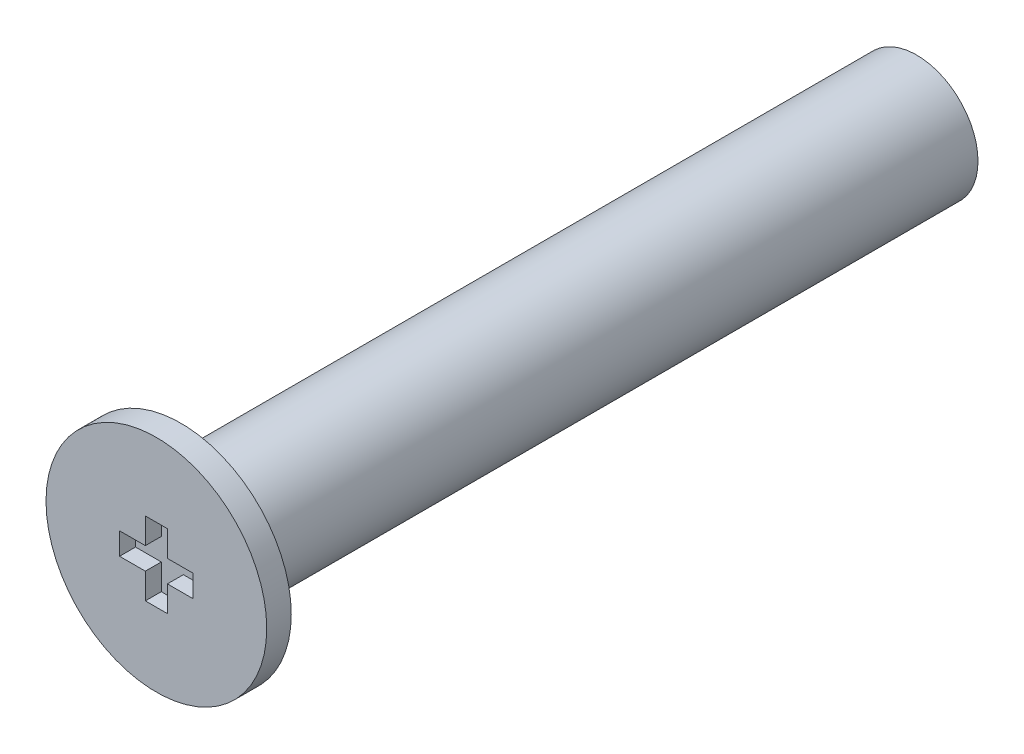
ISO-10303-21;
HEADER;
FILE_DESCRIPTION(('STEP AP214'),'2;1');
FILE_NAME('part.step','',(''),(''),'','','');
FILE_SCHEMA(('AUTOMOTIVE_DESIGN { 1 0 10303 214 1 1 1 1 }'));
ENDSEC;
DATA;
#1=APPLICATION_CONTEXT('core data for automotive mechanical design processes');
#2=APPLICATION_PROTOCOL_DEFINITION('international standard','automotive_design',2000,#1);
#3=PRODUCT_CONTEXT('',#1,'mechanical');
#4=PRODUCT('Part','Part','',(#3));
#5=PRODUCT_RELATED_PRODUCT_CATEGORY('part','',(#4));
#6=PRODUCT_DEFINITION_FORMATION('','',#4);
#7=PRODUCT_DEFINITION_CONTEXT('part definition',#1,'design');
#8=PRODUCT_DEFINITION('design','',#6,#7);
#9=PRODUCT_DEFINITION_SHAPE('','',#8);
#10=(LENGTH_UNIT() NAMED_UNIT(*) SI_UNIT(.MILLI.,.METRE.));
#11=(NAMED_UNIT(*) PLANE_ANGLE_UNIT() SI_UNIT($,.RADIAN.));
#12=(NAMED_UNIT(*) SI_UNIT($,.STERADIAN.) SOLID_ANGLE_UNIT());
#13=UNCERTAINTY_MEASURE_WITH_UNIT(LENGTH_MEASURE(1.E-05),#10,'distance_accuracy_value','');
#14=(GEOMETRIC_REPRESENTATION_CONTEXT(3) GLOBAL_UNCERTAINTY_ASSIGNED_CONTEXT((#13)) GLOBAL_UNIT_ASSIGNED_CONTEXT((#10,
#11,#12)) REPRESENTATION_CONTEXT('',''));
#15=CARTESIAN_POINT('',(0.,0.,0.));
#16=DIRECTION('',(0.,0.,1.));
#17=DIRECTION('',(1.,0.,0.));
#18=AXIS2_PLACEMENT_3D('',#15,#16,#17);
#19=CARTESIAN_POINT('',(0.,0.,-30.));
#20=DIRECTION('',(0.,0.,1.));
#21=DIRECTION('',(1.,0.,0.));
#22=AXIS2_PLACEMENT_3D('',#19,#20,#21);
#23=CYLINDRICAL_SURFACE('',#22,2.5);
#24=CARTESIAN_POINT('',(0.,0.,-30.));
#25=DIRECTION('',(0.,0.,1.));
#26=DIRECTION('',(1.,0.,0.));
#27=AXIS2_PLACEMENT_3D('',#24,#25,#26);
#28=CIRCLE('',#27,2.5);
#29=CARTESIAN_POINT('',(2.5,0.,-30.));
#30=VERTEX_POINT('',#29);
#31=EDGE_CURVE('E212',#30,#30,#28,.T.);
#32=ORIENTED_EDGE('',*,*,#31,.T.);
#33=EDGE_LOOP('',(#32));
#34=FACE_BOUND('',#33,.T.);
#35=CARTESIAN_POINT('',(0.,0.,0.));
#36=DIRECTION('',(0.,0.,1.));
#37=DIRECTION('',(1.,0.,0.));
#38=AXIS2_PLACEMENT_3D('',#35,#36,#37);
#39=CIRCLE('',#38,2.5);
#40=CARTESIAN_POINT('',(2.5,0.,0.));
#41=VERTEX_POINT('',#40);
#42=EDGE_CURVE('E208',#41,#41,#39,.T.);
#43=ORIENTED_EDGE('',*,*,#42,.F.);
#44=EDGE_LOOP('',(#43));
#45=FACE_BOUND('',#44,.T.);
#46=ADVANCED_FACE('F41',(#34,#45),#23,.T.);
#47=CARTESIAN_POINT('',(0.,0.,-30.));
#48=DIRECTION('',(0.,0.,1.));
#49=DIRECTION('',(1.,0.,0.));
#50=AXIS2_PLACEMENT_3D('',#47,#48,#49);
#51=PLANE('',#50);
#52=ORIENTED_EDGE('',*,*,#31,.F.);
#53=EDGE_LOOP('',(#52));
#54=FACE_BOUND('',#53,.T.);
#55=ADVANCED_FACE('F281',(#54),#51,.F.);
#56=CARTESIAN_POINT('',(0.,0.,0.));
#57=DIRECTION('',(0.,0.,1.));
#58=DIRECTION('',(1.,0.,0.));
#59=AXIS2_PLACEMENT_3D('',#56,#57,#58);
#60=PLANE('',#59);
#61=ORIENTED_EDGE('',*,*,#42,.T.);
#62=EDGE_LOOP('',(#61));
#63=FACE_BOUND('',#62,.T.);
#64=CARTESIAN_POINT('',(0.,0.,0.));
#65=DIRECTION('',(0.,0.,-1.));
#66=DIRECTION('',(-1.,0.,0.));
#67=AXIS2_PLACEMENT_3D('',#64,#65,#66);
#68=CIRCLE('',#67,4.5);
#69=CARTESIAN_POINT('',(-4.5,0.,0.));
#70=VERTEX_POINT('',#69);
#71=EDGE_CURVE('E210',#70,#70,#68,.T.);
#72=ORIENTED_EDGE('',*,*,#71,.T.);
#73=EDGE_LOOP('',(#72));
#74=FACE_BOUND('',#73,.T.);
#75=ADVANCED_FACE('F286',(#63,#74),#60,.F.);
#76=CARTESIAN_POINT('',(0.,0.,-2.));
#77=DIRECTION('',(0.,0.,-1.));
#78=DIRECTION('',(-1.,0.,0.));
#79=AXIS2_PLACEMENT_3D('',#76,#77,#78);
#80=CYLINDRICAL_SURFACE('',#79,4.5);
#81=ORIENTED_EDGE('',*,*,#71,.F.);
#82=EDGE_LOOP('',(#81));
#83=FACE_BOUND('',#82,.T.);
#84=CARTESIAN_POINT('',(0.,0.,1.));
#85=DIRECTION('',(0.,0.,-1.));
#86=DIRECTION('',(-1.,0.,0.));
#87=AXIS2_PLACEMENT_3D('',#84,#85,#86);
#88=CIRCLE('',#87,4.5);
#89=CARTESIAN_POINT('',(-4.5,0.,1.));
#90=VERTEX_POINT('',#89);
#91=EDGE_CURVE('E179',#90,#90,#88,.T.);
#92=ORIENTED_EDGE('',*,*,#91,.T.);
#93=EDGE_LOOP('',(#92));
#94=FACE_BOUND('',#93,.T.);
#95=ADVANCED_FACE('F300',(#83,#94),#80,.T.);
#96=CARTESIAN_POINT('',(4.5,0.,1.));
#97=DIRECTION('',(0.,0.,-1.));
#98=DIRECTION('',(-1.,0.,0.));
#99=AXIS2_PLACEMENT_3D('',#96,#97,#98);
#100=PLANE('',#99);
#101=DIRECTION('',(-1.,0.,0.));
#102=VECTOR('',#101,1.);
#103=CARTESIAN_POINT('',(4.5,-1.5,1.));
#104=LINE('',#103,#102);
#105=CARTESIAN_POINT('',(0.45,-1.5,1.));
#106=VERTEX_POINT('',#105);
#107=CARTESIAN_POINT('',(-0.45,-1.5,1.));
#108=VERTEX_POINT('',#107);
#109=EDGE_CURVE('E211',#106,#108,#104,.T.);
#110=ORIENTED_EDGE('',*,*,#109,.T.);
#111=DIRECTION('',(0.,1.,0.));
#112=VECTOR('',#111,1.);
#113=CARTESIAN_POINT('',(-0.45,0.,1.));
#114=LINE('',#113,#112);
#115=CARTESIAN_POINT('',(-0.45,-0.45,1.));
#116=VERTEX_POINT('',#115);
#117=EDGE_CURVE('E11',#108,#116,#114,.T.);
#118=ORIENTED_EDGE('',*,*,#117,.T.);
#119=DIRECTION('',(-1.,0.,0.));
#120=VECTOR('',#119,1.);
#121=CARTESIAN_POINT('',(4.5,-0.45,1.));
#122=LINE('',#121,#120);
#123=CARTESIAN_POINT('',(-1.5,-0.45,1.));
#124=VERTEX_POINT('',#123);
#125=EDGE_CURVE('E48',#116,#124,#122,.T.);
#126=ORIENTED_EDGE('',*,*,#125,.T.);
#127=DIRECTION('',(0.,1.,0.));
#128=VECTOR('',#127,1.);
#129=CARTESIAN_POINT('',(-1.5,0.,1.));
#130=LINE('',#129,#128);
#131=CARTESIAN_POINT('',(-1.5,0.45,1.));
#132=VERTEX_POINT('',#131);
#133=EDGE_CURVE('E241',#124,#132,#130,.T.);
#134=ORIENTED_EDGE('',*,*,#133,.T.);
#135=DIRECTION('',(1.,0.,0.));
#136=VECTOR('',#135,1.);
#137=CARTESIAN_POINT('',(4.5,0.45,1.));
#138=LINE('',#137,#136);
#139=CARTESIAN_POINT('',(-0.45,0.45,1.));
#140=VERTEX_POINT('',#139);
#141=EDGE_CURVE('E236',#132,#140,#138,.T.);
#142=ORIENTED_EDGE('',*,*,#141,.T.);
#143=DIRECTION('',(0.,1.,0.));
#144=VECTOR('',#143,1.);
#145=CARTESIAN_POINT('',(-0.45,0.,1.));
#146=LINE('',#145,#144);
#147=CARTESIAN_POINT('',(-0.45,1.5,1.));
#148=VERTEX_POINT('',#147);
#149=EDGE_CURVE('E237',#140,#148,#146,.T.);
#150=ORIENTED_EDGE('',*,*,#149,.T.);
#151=DIRECTION('',(1.,0.,0.));
#152=VECTOR('',#151,1.);
#153=CARTESIAN_POINT('',(4.5,1.5,1.));
#154=LINE('',#153,#152);
#155=CARTESIAN_POINT('',(0.45,1.5,1.));
#156=VERTEX_POINT('',#155);
#157=EDGE_CURVE('E231',#148,#156,#154,.T.);
#158=ORIENTED_EDGE('',*,*,#157,.T.);
#159=DIRECTION('',(0.,-1.,0.));
#160=VECTOR('',#159,1.);
#161=CARTESIAN_POINT('',(0.45,0.,1.));
#162=LINE('',#161,#160);
#163=CARTESIAN_POINT('',(0.45,0.45,1.));
#164=VERTEX_POINT('',#163);
#165=EDGE_CURVE('E228',#156,#164,#162,.T.);
#166=ORIENTED_EDGE('',*,*,#165,.T.);
#167=DIRECTION('',(1.,0.,0.));
#168=VECTOR('',#167,1.);
#169=CARTESIAN_POINT('',(4.5,0.45,1.));
#170=LINE('',#169,#168);
#171=CARTESIAN_POINT('',(1.5,0.45,1.));
#172=VERTEX_POINT('',#171);
#173=EDGE_CURVE('E229',#164,#172,#170,.T.);
#174=ORIENTED_EDGE('',*,*,#173,.T.);
#175=DIRECTION('',(0.,-1.,0.));
#176=VECTOR('',#175,1.);
#177=CARTESIAN_POINT('',(1.5,0.,1.));
#178=LINE('',#177,#176);
#179=CARTESIAN_POINT('',(1.5,-0.45,1.));
#180=VERTEX_POINT('',#179);
#181=EDGE_CURVE('E224',#172,#180,#178,.T.);
#182=ORIENTED_EDGE('',*,*,#181,.T.);
#183=DIRECTION('',(-1.,0.,0.));
#184=VECTOR('',#183,1.);
#185=CARTESIAN_POINT('',(4.5,-0.45,1.));
#186=LINE('',#185,#184);
#187=CARTESIAN_POINT('',(0.45,-0.45,1.));
#188=VERTEX_POINT('',#187);
#189=EDGE_CURVE('E222',#180,#188,#186,.T.);
#190=ORIENTED_EDGE('',*,*,#189,.T.);
#191=DIRECTION('',(0.,-1.,0.));
#192=VECTOR('',#191,1.);
#193=CARTESIAN_POINT('',(0.45,0.,1.));
#194=LINE('',#193,#192);
#195=EDGE_CURVE('E220',#188,#106,#194,.T.);
#196=ORIENTED_EDGE('',*,*,#195,.T.);
#197=EDGE_LOOP('',(#110,#118,#126,#134,#142,#150,#158,#166,#174,#182,#190,#196));
#198=FACE_BOUND('',#197,.T.);
#199=ORIENTED_EDGE('',*,*,#91,.F.);
#200=EDGE_LOOP('',(#199));
#201=FACE_BOUND('',#200,.T.);
#202=ADVANCED_FACE('F242',(#198,#201),#100,.F.);
#203=CARTESIAN_POINT('',(-0.45,-0.45,0.35));
#204=DIRECTION('',(-1.,0.,0.));
#205=DIRECTION('',(0.,0.,1.));
#206=AXIS2_PLACEMENT_3D('',#203,#204,#205);
#207=PLANE('',#206);
#208=DIRECTION('',(0.,0.,1.));
#209=VECTOR('',#208,1.);
#210=CARTESIAN_POINT('',(-0.45,-1.5,0.35));
#211=LINE('',#210,#209);
#212=CARTESIAN_POINT('',(-0.45,-1.5,0.35));
#213=VERTEX_POINT('',#212);
#214=EDGE_CURVE('E54',#213,#108,#211,.T.);
#215=ORIENTED_EDGE('',*,*,#214,.F.);
#216=DIRECTION('',(0.,-1.,0.));
#217=VECTOR('',#216,1.);
#218=CARTESIAN_POINT('',(-0.45,-0.45,0.35));
#219=LINE('',#218,#217);
#220=CARTESIAN_POINT('',(-0.45,-0.45,0.35));
#221=VERTEX_POINT('',#220);
#222=EDGE_CURVE('E129',#221,#213,#219,.T.);
#223=ORIENTED_EDGE('',*,*,#222,.F.);
#224=DIRECTION('',(0.,0.,1.));
#225=VECTOR('',#224,1.);
#226=CARTESIAN_POINT('',(-0.45,-0.45,0.35));
#227=LINE('',#226,#225);
#228=EDGE_CURVE('E171',#221,#116,#227,.T.);
#229=ORIENTED_EDGE('',*,*,#228,.T.);
#230=ORIENTED_EDGE('',*,*,#117,.F.);
#231=EDGE_LOOP('',(#215,#223,#229,#230));
#232=FACE_BOUND('',#231,.T.);
#233=ADVANCED_FACE('F127',(#232),#207,.F.);
#234=CARTESIAN_POINT('',(-1.5,-0.45,0.35));
#235=DIRECTION('',(0.,-1.,0.));
#236=DIRECTION('',(0.,0.,-1.));
#237=AXIS2_PLACEMENT_3D('',#234,#235,#236);
#238=PLANE('',#237);
#239=ORIENTED_EDGE('',*,*,#228,.F.);
#240=DIRECTION('',(1.,0.,0.));
#241=VECTOR('',#240,1.);
#242=CARTESIAN_POINT('',(-1.5,-0.45,0.35));
#243=LINE('',#242,#241);
#244=CARTESIAN_POINT('',(-1.5,-0.45,0.35));
#245=VERTEX_POINT('',#244);
#246=EDGE_CURVE('E131',#245,#221,#243,.T.);
#247=ORIENTED_EDGE('',*,*,#246,.F.);
#248=DIRECTION('',(0.,0.,1.));
#249=VECTOR('',#248,1.);
#250=CARTESIAN_POINT('',(-1.5,-0.45,0.35));
#251=LINE('',#250,#249);
#252=EDGE_CURVE('E180',#245,#124,#251,.T.);
#253=ORIENTED_EDGE('',*,*,#252,.T.);
#254=ORIENTED_EDGE('',*,*,#125,.F.);
#255=EDGE_LOOP('',(#239,#247,#253,#254));
#256=FACE_BOUND('',#255,.T.);
#257=ADVANCED_FACE('F273',(#256),#238,.F.);
#258=CARTESIAN_POINT('',(-1.5,0.45,0.35));
#259=DIRECTION('',(-1.,0.,0.));
#260=DIRECTION('',(0.,0.,1.));
#261=AXIS2_PLACEMENT_3D('',#258,#259,#260);
#262=PLANE('',#261);
#263=ORIENTED_EDGE('',*,*,#252,.F.);
#264=DIRECTION('',(0.,-1.,0.));
#265=VECTOR('',#264,1.);
#266=CARTESIAN_POINT('',(-1.5,0.45,0.35));
#267=LINE('',#266,#265);
#268=CARTESIAN_POINT('',(-1.5,0.45,0.35));
#269=VERTEX_POINT('',#268);
#270=EDGE_CURVE('E175',#269,#245,#267,.T.);
#271=ORIENTED_EDGE('',*,*,#270,.F.);
#272=DIRECTION('',(0.,0.,1.));
#273=VECTOR('',#272,1.);
#274=CARTESIAN_POINT('',(-1.5,0.45,0.35));
#275=LINE('',#274,#273);
#276=EDGE_CURVE('E178',#269,#132,#275,.T.);
#277=ORIENTED_EDGE('',*,*,#276,.T.);
#278=ORIENTED_EDGE('',*,*,#133,.F.);
#279=EDGE_LOOP('',(#263,#271,#277,#278));
#280=FACE_BOUND('',#279,.T.);
#281=ADVANCED_FACE('F275',(#280),#262,.F.);
#282=CARTESIAN_POINT('',(-0.45,0.45,0.35));
#283=DIRECTION('',(0.,1.,0.));
#284=DIRECTION('',(0.,0.,1.));
#285=AXIS2_PLACEMENT_3D('',#282,#283,#284);
#286=PLANE('',#285);
#287=ORIENTED_EDGE('',*,*,#276,.F.);
#288=DIRECTION('',(-1.,0.,0.));
#289=VECTOR('',#288,1.);
#290=CARTESIAN_POINT('',(-0.45,0.45,0.35));
#291=LINE('',#290,#289);
#292=CARTESIAN_POINT('',(-0.45,0.45,0.35));
#293=VERTEX_POINT('',#292);
#294=EDGE_CURVE('E168',#293,#269,#291,.T.);
#295=ORIENTED_EDGE('',*,*,#294,.F.);
#296=DIRECTION('',(0.,0.,1.));
#297=VECTOR('',#296,1.);
#298=CARTESIAN_POINT('',(-0.45,0.45,0.35));
#299=LINE('',#298,#297);
#300=EDGE_CURVE('E181',#293,#140,#299,.T.);
#301=ORIENTED_EDGE('',*,*,#300,.T.);
#302=ORIENTED_EDGE('',*,*,#141,.F.);
#303=EDGE_LOOP('',(#287,#295,#301,#302));
#304=FACE_BOUND('',#303,.T.);
#305=ADVANCED_FACE('F269',(#304),#286,.F.);
#306=CARTESIAN_POINT('',(-0.45,1.5,0.35));
#307=DIRECTION('',(-1.,0.,0.));
#308=DIRECTION('',(0.,0.,1.));
#309=AXIS2_PLACEMENT_3D('',#306,#307,#308);
#310=PLANE('',#309);
#311=ORIENTED_EDGE('',*,*,#300,.F.);
#312=DIRECTION('',(0.,-1.,0.));
#313=VECTOR('',#312,1.);
#314=CARTESIAN_POINT('',(-0.45,1.5,0.35));
#315=LINE('',#314,#313);
#316=CARTESIAN_POINT('',(-0.45,1.5,0.35));
#317=VERTEX_POINT('',#316);
#318=EDGE_CURVE('E169',#317,#293,#315,.T.);
#319=ORIENTED_EDGE('',*,*,#318,.F.);
#320=DIRECTION('',(0.,0.,1.));
#321=VECTOR('',#320,1.);
#322=CARTESIAN_POINT('',(-0.45,1.5,0.35));
#323=LINE('',#322,#321);
#324=EDGE_CURVE('E188',#317,#148,#323,.T.);
#325=ORIENTED_EDGE('',*,*,#324,.T.);
#326=ORIENTED_EDGE('',*,*,#149,.F.);
#327=EDGE_LOOP('',(#311,#319,#325,#326));
#328=FACE_BOUND('',#327,.T.);
#329=ADVANCED_FACE('F266',(#328),#310,.F.);
#330=CARTESIAN_POINT('',(0.45,1.5,0.35));
#331=DIRECTION('',(0.,1.,0.));
#332=DIRECTION('',(0.,0.,1.));
#333=AXIS2_PLACEMENT_3D('',#330,#331,#332);
#334=PLANE('',#333);
#335=ORIENTED_EDGE('',*,*,#324,.F.);
#336=DIRECTION('',(-1.,0.,0.));
#337=VECTOR('',#336,1.);
#338=CARTESIAN_POINT('',(0.45,1.5,0.35));
#339=LINE('',#338,#337);
#340=CARTESIAN_POINT('',(0.45,1.5,0.35));
#341=VERTEX_POINT('',#340);
#342=EDGE_CURVE('E164',#341,#317,#339,.T.);
#343=ORIENTED_EDGE('',*,*,#342,.F.);
#344=DIRECTION('',(0.,0.,1.));
#345=VECTOR('',#344,1.);
#346=CARTESIAN_POINT('',(0.45,1.5,0.35));
#347=LINE('',#346,#345);
#348=EDGE_CURVE('E189',#341,#156,#347,.T.);
#349=ORIENTED_EDGE('',*,*,#348,.T.);
#350=ORIENTED_EDGE('',*,*,#157,.F.);
#351=EDGE_LOOP('',(#335,#343,#349,#350));
#352=FACE_BOUND('',#351,.T.);
#353=ADVANCED_FACE('F261',(#352),#334,.F.);
#354=CARTESIAN_POINT('',(0.45,0.45,0.35));
#355=DIRECTION('',(1.,0.,0.));
#356=DIRECTION('',(0.,0.,-1.));
#357=AXIS2_PLACEMENT_3D('',#354,#355,#356);
#358=PLANE('',#357);
#359=ORIENTED_EDGE('',*,*,#348,.F.);
#360=DIRECTION('',(0.,1.,0.));
#361=VECTOR('',#360,1.);
#362=CARTESIAN_POINT('',(0.45,0.45,0.35));
#363=LINE('',#362,#361);
#364=CARTESIAN_POINT('',(0.45,0.45,0.35));
#365=VERTEX_POINT('',#364);
#366=EDGE_CURVE('E158',#365,#341,#363,.T.);
#367=ORIENTED_EDGE('',*,*,#366,.F.);
#368=DIRECTION('',(0.,0.,1.));
#369=VECTOR('',#368,1.);
#370=CARTESIAN_POINT('',(0.45,0.45,0.35));
#371=LINE('',#370,#369);
#372=EDGE_CURVE('E195',#365,#164,#371,.T.);
#373=ORIENTED_EDGE('',*,*,#372,.T.);
#374=ORIENTED_EDGE('',*,*,#165,.F.);
#375=EDGE_LOOP('',(#359,#367,#373,#374));
#376=FACE_BOUND('',#375,.T.);
#377=ADVANCED_FACE('F263',(#376),#358,.F.);
#378=CARTESIAN_POINT('',(1.5,0.45,0.35));
#379=DIRECTION('',(0.,1.,0.));
#380=DIRECTION('',(0.,0.,1.));
#381=AXIS2_PLACEMENT_3D('',#378,#379,#380);
#382=PLANE('',#381);
#383=ORIENTED_EDGE('',*,*,#372,.F.);
#384=DIRECTION('',(-1.,0.,0.));
#385=VECTOR('',#384,1.);
#386=CARTESIAN_POINT('',(1.5,0.45,0.35));
#387=LINE('',#386,#385);
#388=CARTESIAN_POINT('',(1.5,0.45,0.35));
#389=VERTEX_POINT('',#388);
#390=EDGE_CURVE('E160',#389,#365,#387,.T.);
#391=ORIENTED_EDGE('',*,*,#390,.F.);
#392=DIRECTION('',(0.,0.,1.));
#393=VECTOR('',#392,1.);
#394=CARTESIAN_POINT('',(1.5,0.45,0.35));
#395=LINE('',#394,#393);
#396=EDGE_CURVE('E194',#389,#172,#395,.T.);
#397=ORIENTED_EDGE('',*,*,#396,.T.);
#398=ORIENTED_EDGE('',*,*,#173,.F.);
#399=EDGE_LOOP('',(#383,#391,#397,#398));
#400=FACE_BOUND('',#399,.T.);
#401=ADVANCED_FACE('F257',(#400),#382,.F.);
#402=CARTESIAN_POINT('',(1.5,-0.45,0.35));
#403=DIRECTION('',(1.,0.,0.));
#404=DIRECTION('',(0.,0.,-1.));
#405=AXIS2_PLACEMENT_3D('',#402,#403,#404);
#406=PLANE('',#405);
#407=ORIENTED_EDGE('',*,*,#396,.F.);
#408=DIRECTION('',(0.,1.,0.));
#409=VECTOR('',#408,1.);
#410=CARTESIAN_POINT('',(1.5,-0.45,0.35));
#411=LINE('',#410,#409);
#412=CARTESIAN_POINT('',(1.5,-0.45,0.35));
#413=VERTEX_POINT('',#412);
#414=EDGE_CURVE('E151',#413,#389,#411,.T.);
#415=ORIENTED_EDGE('',*,*,#414,.F.);
#416=DIRECTION('',(0.,0.,1.));
#417=VECTOR('',#416,1.);
#418=CARTESIAN_POINT('',(1.5,-0.45,0.35));
#419=LINE('',#418,#417);
#420=EDGE_CURVE('E198',#413,#180,#419,.T.);
#421=ORIENTED_EDGE('',*,*,#420,.T.);
#422=ORIENTED_EDGE('',*,*,#181,.F.);
#423=EDGE_LOOP('',(#407,#415,#421,#422));
#424=FACE_BOUND('',#423,.T.);
#425=ADVANCED_FACE('F251',(#424),#406,.F.);
#426=CARTESIAN_POINT('',(0.45,-0.45,0.35));
#427=DIRECTION('',(0.,-1.,0.));
#428=DIRECTION('',(0.,0.,-1.));
#429=AXIS2_PLACEMENT_3D('',#426,#427,#428);
#430=PLANE('',#429);
#431=ORIENTED_EDGE('',*,*,#420,.F.);
#432=DIRECTION('',(1.,0.,0.));
#433=VECTOR('',#432,1.);
#434=CARTESIAN_POINT('',(0.45,-0.45,0.35));
#435=LINE('',#434,#433);
#436=CARTESIAN_POINT('',(0.45,-0.45,0.35));
#437=VERTEX_POINT('',#436);
#438=EDGE_CURVE('E152',#437,#413,#435,.T.);
#439=ORIENTED_EDGE('',*,*,#438,.F.);
#440=DIRECTION('',(0.,0.,1.));
#441=VECTOR('',#440,1.);
#442=CARTESIAN_POINT('',(0.45,-0.45,0.35));
#443=LINE('',#442,#441);
#444=EDGE_CURVE('E201',#437,#188,#443,.T.);
#445=ORIENTED_EDGE('',*,*,#444,.T.);
#446=ORIENTED_EDGE('',*,*,#189,.F.);
#447=EDGE_LOOP('',(#431,#439,#445,#446));
#448=FACE_BOUND('',#447,.T.);
#449=ADVANCED_FACE('F254',(#448),#430,.F.);
#450=CARTESIAN_POINT('',(0.45,-1.5,0.35));
#451=DIRECTION('',(1.,0.,0.));
#452=DIRECTION('',(0.,0.,-1.));
#453=AXIS2_PLACEMENT_3D('',#450,#451,#452);
#454=PLANE('',#453);
#455=ORIENTED_EDGE('',*,*,#444,.F.);
#456=DIRECTION('',(0.,1.,0.));
#457=VECTOR('',#456,1.);
#458=CARTESIAN_POINT('',(0.45,-1.5,0.35));
#459=LINE('',#458,#457);
#460=CARTESIAN_POINT('',(0.45,-1.5,0.35));
#461=VERTEX_POINT('',#460);
#462=EDGE_CURVE('E145',#461,#437,#459,.T.);
#463=ORIENTED_EDGE('',*,*,#462,.F.);
#464=DIRECTION('',(0.,0.,1.));
#465=VECTOR('',#464,1.);
#466=CARTESIAN_POINT('',(0.45,-1.5,0.35));
#467=LINE('',#466,#465);
#468=EDGE_CURVE('E134',#461,#106,#467,.T.);
#469=ORIENTED_EDGE('',*,*,#468,.T.);
#470=ORIENTED_EDGE('',*,*,#195,.F.);
#471=EDGE_LOOP('',(#455,#463,#469,#470));
#472=FACE_BOUND('',#471,.T.);
#473=ADVANCED_FACE('F248',(#472),#454,.F.);
#474=CARTESIAN_POINT('',(-0.45,-1.5,0.35));
#475=DIRECTION('',(0.,-1.,0.));
#476=DIRECTION('',(0.,0.,-1.));
#477=AXIS2_PLACEMENT_3D('',#474,#475,#476);
#478=PLANE('',#477);
#479=ORIENTED_EDGE('',*,*,#468,.F.);
#480=DIRECTION('',(1.,0.,0.));
#481=VECTOR('',#480,1.);
#482=CARTESIAN_POINT('',(-0.45,-1.5,0.35));
#483=LINE('',#482,#481);
#484=EDGE_CURVE('E140',#213,#461,#483,.T.);
#485=ORIENTED_EDGE('',*,*,#484,.F.);
#486=ORIENTED_EDGE('',*,*,#214,.T.);
#487=ORIENTED_EDGE('',*,*,#109,.F.);
#488=EDGE_LOOP('',(#479,#485,#486,#487));
#489=FACE_BOUND('',#488,.T.);
#490=ADVANCED_FACE('F139',(#489),#478,.F.);
#491=CARTESIAN_POINT('',(0.,0.,0.35));
#492=DIRECTION('',(0.,0.,1.));
#493=DIRECTION('',(1.,0.,0.));
#494=AXIS2_PLACEMENT_3D('',#491,#492,#493);
#495=PLANE('',#494);
#496=ORIENTED_EDGE('',*,*,#222,.T.);
#497=ORIENTED_EDGE('',*,*,#484,.T.);
#498=ORIENTED_EDGE('',*,*,#462,.T.);
#499=ORIENTED_EDGE('',*,*,#438,.T.);
#500=ORIENTED_EDGE('',*,*,#414,.T.);
#501=ORIENTED_EDGE('',*,*,#390,.T.);
#502=ORIENTED_EDGE('',*,*,#366,.T.);
#503=ORIENTED_EDGE('',*,*,#342,.T.);
#504=ORIENTED_EDGE('',*,*,#318,.T.);
#505=ORIENTED_EDGE('',*,*,#294,.T.);
#506=ORIENTED_EDGE('',*,*,#270,.T.);
#507=ORIENTED_EDGE('',*,*,#246,.T.);
#508=EDGE_LOOP('',(#496,#497,#498,#499,#500,#501,#502,#503,#504,#505,#506,#507));
#509=FACE_BOUND('',#508,.T.);
#510=ADVANCED_FACE('F142',(#509),#495,.T.);
#511=CLOSED_SHELL('',(#46,#55,#75,#95,#202,#233,#257,#281,#305,#329,#353,#377,#401,#425,#449,
#473,#490,#510));
#512=MANIFOLD_SOLID_BREP('B2',#511);
#513=ADVANCED_BREP_SHAPE_REPRESENTATION('',(#18,#512),#14);
#514=SHAPE_DEFINITION_REPRESENTATION(#9,#513);
ENDSEC;
END-ISO-10303-21;
